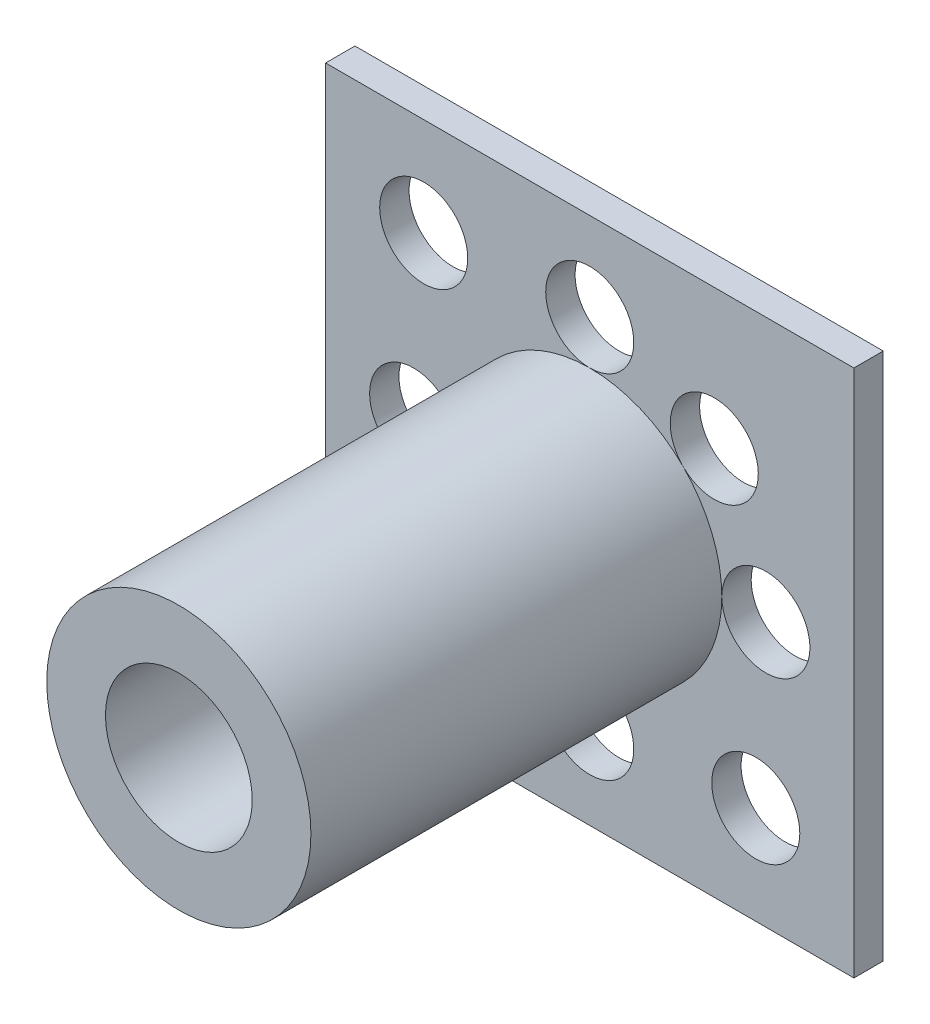
ISO-10303-21;
HEADER;
FILE_DESCRIPTION(('STEP AP214'),'2;1');
FILE_NAME('part.step','',(''),(''),'','','');
FILE_SCHEMA(('AUTOMOTIVE_DESIGN { 1 0 10303 214 1 1 1 1 }'));
ENDSEC;
DATA;
#1=APPLICATION_CONTEXT('core data for automotive mechanical design processes');
#2=APPLICATION_PROTOCOL_DEFINITION('international standard','automotive_design',2000,#1);
#3=PRODUCT_CONTEXT('',#1,'mechanical');
#4=PRODUCT('Part','Part','',(#3));
#5=PRODUCT_RELATED_PRODUCT_CATEGORY('part','',(#4));
#6=PRODUCT_DEFINITION_FORMATION('','',#4);
#7=PRODUCT_DEFINITION_CONTEXT('part definition',#1,'design');
#8=PRODUCT_DEFINITION('design','',#6,#7);
#9=PRODUCT_DEFINITION_SHAPE('','',#8);
#10=(LENGTH_UNIT() NAMED_UNIT(*) SI_UNIT(.MILLI.,.METRE.));
#11=(NAMED_UNIT(*) PLANE_ANGLE_UNIT() SI_UNIT($,.RADIAN.));
#12=(NAMED_UNIT(*) SI_UNIT($,.STERADIAN.) SOLID_ANGLE_UNIT());
#13=UNCERTAINTY_MEASURE_WITH_UNIT(LENGTH_MEASURE(1.E-05),#10,'distance_accuracy_value','');
#14=(GEOMETRIC_REPRESENTATION_CONTEXT(3) GLOBAL_UNCERTAINTY_ASSIGNED_CONTEXT((#13)) GLOBAL_UNIT_ASSIGNED_CONTEXT((#10,
#11,#12)) REPRESENTATION_CONTEXT('',''));
#15=CARTESIAN_POINT('',(0.,0.,0.));
#16=DIRECTION('',(0.,0.,1.));
#17=DIRECTION('',(1.,0.,0.));
#18=AXIS2_PLACEMENT_3D('',#15,#16,#17);
#19=CARTESIAN_POINT('',(0.,0.,15.));
#20=DIRECTION('',(0.,0.,1.));
#21=DIRECTION('',(1.,0.,0.));
#22=AXIS2_PLACEMENT_3D('',#19,#20,#21);
#23=PLANE('',#22);
#24=CARTESIAN_POINT('',(0.,0.,15.));
#25=DIRECTION('',(0.,0.,1.));
#26=DIRECTION('',(1.,0.,0.));
#27=AXIS2_PLACEMENT_3D('',#24,#25,#26);
#28=CIRCLE('',#27,4.5);
#29=CARTESIAN_POINT('',(4.5,0.,15.));
#30=VERTEX_POINT('',#29);
#31=EDGE_CURVE('E11',#30,#30,#28,.T.);
#32=ORIENTED_EDGE('',*,*,#31,.T.);
#33=EDGE_LOOP('',(#32));
#34=FACE_BOUND('',#33,.T.);
#35=CARTESIAN_POINT('',(0.,0.,15.));
#36=DIRECTION('',(0.,0.,1.));
#37=DIRECTION('',(1.,0.,0.));
#38=AXIS2_PLACEMENT_3D('',#35,#36,#37);
#39=CIRCLE('',#38,2.5);
#40=CARTESIAN_POINT('',(2.5,0.,15.));
#41=VERTEX_POINT('',#40);
#42=EDGE_CURVE('E48',#41,#41,#39,.T.);
#43=ORIENTED_EDGE('',*,*,#42,.F.);
#44=EDGE_LOOP('',(#43));
#45=FACE_BOUND('',#44,.T.);
#46=ADVANCED_FACE('F39',(#34,#45),#23,.T.);
#47=CARTESIAN_POINT('',(0.,0.,15.));
#48=DIRECTION('',(0.,0.,-1.));
#49=DIRECTION('',(-1.,0.,0.));
#50=AXIS2_PLACEMENT_3D('',#47,#48,#49);
#51=CYLINDRICAL_SURFACE('',#50,4.5);
#52=CARTESIAN_POINT('',(0.,0.,1.));
#53=DIRECTION('',(0.,0.,1.));
#54=DIRECTION('',(1.,0.,0.));
#55=AXIS2_PLACEMENT_3D('',#52,#53,#54);
#56=CIRCLE('',#55,4.5);
#57=CARTESIAN_POINT('',(4.5,0.,1.));
#58=VERTEX_POINT('',#57);
#59=CARTESIAN_POINT('',(3.18198051533946,3.18198051533946,1.));
#60=VERTEX_POINT('',#59);
#61=EDGE_CURVE('E132',#58,#60,#56,.T.);
#62=ORIENTED_EDGE('',*,*,#61,.T.);
#63=CARTESIAN_POINT('',(0.,4.5,1.));
#64=VERTEX_POINT('',#63);
#65=EDGE_CURVE('E138',#60,#64,#56,.T.);
#66=ORIENTED_EDGE('',*,*,#65,.T.);
#67=CARTESIAN_POINT('',(-4.5,0.,1.));
#68=VERTEX_POINT('',#67);
#69=EDGE_CURVE('E419',#64,#68,#56,.T.);
#70=ORIENTED_EDGE('',*,*,#69,.T.);
#71=CARTESIAN_POINT('',(-3.18198051533946,-3.18198051533946,1.));
#72=VERTEX_POINT('',#71);
#73=EDGE_CURVE('E423',#68,#72,#56,.T.);
#74=ORIENTED_EDGE('',*,*,#73,.T.);
#75=CARTESIAN_POINT('',(0.,-4.5,1.));
#76=VERTEX_POINT('',#75);
#77=EDGE_CURVE('E130',#72,#76,#56,.T.);
#78=ORIENTED_EDGE('',*,*,#77,.T.);
#79=EDGE_CURVE('E125',#76,#58,#56,.T.);
#80=ORIENTED_EDGE('',*,*,#79,.T.);
#81=EDGE_LOOP('',(#62,#66,#70,#74,#78,#80));
#82=FACE_BOUND('',#81,.T.);
#83=ORIENTED_EDGE('',*,*,#31,.F.);
#84=EDGE_LOOP('',(#83));
#85=FACE_BOUND('',#84,.T.);
#86=ADVANCED_FACE('F41',(#82,#85),#51,.T.);
#87=CARTESIAN_POINT('',(0.,0.,15.));
#88=DIRECTION('',(0.,0.,-1.));
#89=DIRECTION('',(-1.,0.,0.));
#90=AXIS2_PLACEMENT_3D('',#87,#88,#89);
#91=CYLINDRICAL_SURFACE('',#90,2.5);
#92=CARTESIAN_POINT('',(0.,0.,0.));
#93=DIRECTION('',(0.,0.,-1.));
#94=DIRECTION('',(-1.,0.,0.));
#95=AXIS2_PLACEMENT_3D('',#92,#93,#94);
#96=CIRCLE('',#95,2.5);
#97=CARTESIAN_POINT('',(-2.5,0.,0.));
#98=VERTEX_POINT('',#97);
#99=EDGE_CURVE('E199',#98,#98,#96,.T.);
#100=ORIENTED_EDGE('',*,*,#99,.T.);
#101=EDGE_LOOP('',(#100));
#102=FACE_BOUND('',#101,.T.);
#103=ORIENTED_EDGE('',*,*,#42,.T.);
#104=EDGE_LOOP('',(#103));
#105=FACE_BOUND('',#104,.T.);
#106=ADVANCED_FACE('F143',(#102,#105),#91,.F.);
#107=CARTESIAN_POINT('',(-9.,-9.,1.));
#108=DIRECTION('',(1.,0.,0.));
#109=DIRECTION('',(0.,0.,-1.));
#110=AXIS2_PLACEMENT_3D('',#107,#108,#109);
#111=PLANE('',#110);
#112=DIRECTION('',(0.,-1.,0.));
#113=VECTOR('',#112,1.);
#114=CARTESIAN_POINT('',(-9.,-9.,0.));
#115=LINE('',#114,#113);
#116=CARTESIAN_POINT('',(-9.,9.,0.));
#117=VERTEX_POINT('',#116);
#118=CARTESIAN_POINT('',(-9.,-9.,0.));
#119=VERTEX_POINT('',#118);
#120=EDGE_CURVE('E123',#117,#119,#115,.T.);
#121=ORIENTED_EDGE('',*,*,#120,.T.);
#122=DIRECTION('',(0.,0.,-1.));
#123=VECTOR('',#122,1.);
#124=CARTESIAN_POINT('',(-9.,-9.,1.));
#125=LINE('',#124,#123);
#126=CARTESIAN_POINT('',(-9.,-9.,1.));
#127=VERTEX_POINT('',#126);
#128=EDGE_CURVE('E101',#127,#119,#125,.T.);
#129=ORIENTED_EDGE('',*,*,#128,.F.);
#130=DIRECTION('',(0.,-1.,0.));
#131=VECTOR('',#130,1.);
#132=CARTESIAN_POINT('',(-9.,-9.,1.));
#133=LINE('',#132,#131);
#134=CARTESIAN_POINT('',(-9.,9.,1.));
#135=VERTEX_POINT('',#134);
#136=EDGE_CURVE('E109',#135,#127,#133,.T.);
#137=ORIENTED_EDGE('',*,*,#136,.F.);
#138=DIRECTION('',(0.,0.,-1.));
#139=VECTOR('',#138,1.);
#140=CARTESIAN_POINT('',(-9.,9.,1.));
#141=LINE('',#140,#139);
#142=EDGE_CURVE('E224',#135,#117,#141,.T.);
#143=ORIENTED_EDGE('',*,*,#142,.T.);
#144=EDGE_LOOP('',(#121,#129,#137,#143));
#145=FACE_BOUND('',#144,.T.);
#146=ADVANCED_FACE('F121',(#145),#111,.F.);
#147=CARTESIAN_POINT('',(9.,-9.,1.));
#148=DIRECTION('',(0.,1.,0.));
#149=DIRECTION('',(-1.,0.,0.));
#150=AXIS2_PLACEMENT_3D('',#147,#148,#149);
#151=PLANE('',#150);
#152=DIRECTION('',(1.,0.,0.));
#153=VECTOR('',#152,1.);
#154=CARTESIAN_POINT('',(9.,-9.,0.));
#155=LINE('',#154,#153);
#156=CARTESIAN_POINT('',(9.,-9.,0.));
#157=VERTEX_POINT('',#156);
#158=EDGE_CURVE('E206',#119,#157,#155,.T.);
#159=ORIENTED_EDGE('',*,*,#158,.T.);
#160=DIRECTION('',(0.,0.,-1.));
#161=VECTOR('',#160,1.);
#162=CARTESIAN_POINT('',(9.,-9.,1.));
#163=LINE('',#162,#161);
#164=CARTESIAN_POINT('',(9.,-9.,1.));
#165=VERTEX_POINT('',#164);
#166=EDGE_CURVE('E104',#165,#157,#163,.T.);
#167=ORIENTED_EDGE('',*,*,#166,.F.);
#168=DIRECTION('',(1.,0.,0.));
#169=VECTOR('',#168,1.);
#170=CARTESIAN_POINT('',(9.,-9.,1.));
#171=LINE('',#170,#169);
#172=EDGE_CURVE('E97',#127,#165,#171,.T.);
#173=ORIENTED_EDGE('',*,*,#172,.F.);
#174=ORIENTED_EDGE('',*,*,#128,.T.);
#175=EDGE_LOOP('',(#159,#167,#173,#174));
#176=FACE_BOUND('',#175,.T.);
#177=ADVANCED_FACE('F99',(#176),#151,.F.);
#178=CARTESIAN_POINT('',(9.,-9.,1.));
#179=DIRECTION('',(-1.,0.,0.));
#180=DIRECTION('',(0.,0.,1.));
#181=AXIS2_PLACEMENT_3D('',#178,#179,#180);
#182=PLANE('',#181);
#183=DIRECTION('',(0.,1.,0.));
#184=VECTOR('',#183,1.);
#185=CARTESIAN_POINT('',(9.,-9.,0.));
#186=LINE('',#185,#184);
#187=CARTESIAN_POINT('',(9.,9.,0.));
#188=VERTEX_POINT('',#187);
#189=EDGE_CURVE('E212',#157,#188,#186,.T.);
#190=ORIENTED_EDGE('',*,*,#189,.T.);
#191=DIRECTION('',(0.,0.,-1.));
#192=VECTOR('',#191,1.);
#193=CARTESIAN_POINT('',(9.,9.,1.));
#194=LINE('',#193,#192);
#195=CARTESIAN_POINT('',(9.,9.,1.));
#196=VERTEX_POINT('',#195);
#197=EDGE_CURVE('E133',#196,#188,#194,.T.);
#198=ORIENTED_EDGE('',*,*,#197,.F.);
#199=DIRECTION('',(0.,1.,0.));
#200=VECTOR('',#199,1.);
#201=CARTESIAN_POINT('',(9.,-9.,1.));
#202=LINE('',#201,#200);
#203=EDGE_CURVE('E108',#165,#196,#202,.T.);
#204=ORIENTED_EDGE('',*,*,#203,.F.);
#205=ORIENTED_EDGE('',*,*,#166,.T.);
#206=EDGE_LOOP('',(#190,#198,#204,#205));
#207=FACE_BOUND('',#206,.T.);
#208=ADVANCED_FACE('F231',(#207),#182,.F.);
#209=CARTESIAN_POINT('',(9.,9.,1.));
#210=DIRECTION('',(0.,-1.,0.));
#211=DIRECTION('',(1.,0.,0.));
#212=AXIS2_PLACEMENT_3D('',#209,#210,#211);
#213=PLANE('',#212);
#214=DIRECTION('',(-1.,0.,0.));
#215=VECTOR('',#214,1.);
#216=CARTESIAN_POINT('',(9.,9.,0.));
#217=LINE('',#216,#215);
#218=EDGE_CURVE('E119',#188,#117,#217,.T.);
#219=ORIENTED_EDGE('',*,*,#218,.T.);
#220=ORIENTED_EDGE('',*,*,#142,.F.);
#221=DIRECTION('',(-1.,0.,0.));
#222=VECTOR('',#221,1.);
#223=CARTESIAN_POINT('',(9.,9.,1.));
#224=LINE('',#223,#222);
#225=EDGE_CURVE('E114',#196,#135,#224,.T.);
#226=ORIENTED_EDGE('',*,*,#225,.F.);
#227=ORIENTED_EDGE('',*,*,#197,.T.);
#228=EDGE_LOOP('',(#219,#220,#226,#227));
#229=FACE_BOUND('',#228,.T.);
#230=ADVANCED_FACE('F165',(#229),#213,.F.);
#231=CARTESIAN_POINT('',(0.,0.,1.));
#232=DIRECTION('',(0.,0.,1.));
#233=DIRECTION('',(1.,0.,0.));
#234=AXIS2_PLACEMENT_3D('',#231,#232,#233);
#235=PLANE('',#234);
#236=CARTESIAN_POINT('',(5.65685424949238,-5.65685424949237,1.));
#237=DIRECTION('',(0.,0.,1.));
#238=DIRECTION('',(1.,0.,0.));
#239=AXIS2_PLACEMENT_3D('',#236,#237,#238);
#240=CIRCLE('',#239,1.5);
#241=CARTESIAN_POINT('',(7.15685424949238,-5.65685424949237,1.));
#242=VERTEX_POINT('',#241);
#243=EDGE_CURVE('E208',#242,#242,#240,.T.);
#244=ORIENTED_EDGE('',*,*,#243,.F.);
#245=EDGE_LOOP('',(#244));
#246=FACE_BOUND('',#245,.T.);
#247=CARTESIAN_POINT('',(-5.65685424949238,5.65685424949238,1.));
#248=DIRECTION('',(0.,0.,1.));
#249=DIRECTION('',(1.,0.,0.));
#250=AXIS2_PLACEMENT_3D('',#247,#248,#249);
#251=CIRCLE('',#250,1.5);
#252=CARTESIAN_POINT('',(-4.15685424949238,5.65685424949238,1.));
#253=VERTEX_POINT('',#252);
#254=EDGE_CURVE('E250',#253,#253,#251,.T.);
#255=ORIENTED_EDGE('',*,*,#254,.F.);
#256=EDGE_LOOP('',(#255));
#257=FACE_BOUND('',#256,.T.);
#258=ORIENTED_EDGE('',*,*,#65,.F.);
#259=CARTESIAN_POINT('',(4.24264068711928,4.24264068711929,1.));
#260=DIRECTION('',(0.,0.,1.));
#261=DIRECTION('',(1.,0.,0.));
#262=AXIS2_PLACEMENT_3D('',#259,#260,#261);
#263=CIRCLE('',#262,1.5);
#264=EDGE_CURVE('E215',#60,#60,#263,.T.);
#265=ORIENTED_EDGE('',*,*,#264,.F.);
#266=ORIENTED_EDGE('',*,*,#61,.F.);
#267=CARTESIAN_POINT('',(6.,0.,1.));
#268=DIRECTION('',(0.,0.,1.));
#269=DIRECTION('',(1.,0.,0.));
#270=AXIS2_PLACEMENT_3D('',#267,#268,#269);
#271=CIRCLE('',#270,1.5);
#272=EDGE_CURVE('E242',#58,#58,#271,.T.);
#273=ORIENTED_EDGE('',*,*,#272,.F.);
#274=ORIENTED_EDGE('',*,*,#79,.F.);
#275=CARTESIAN_POINT('',(0.,-6.,1.));
#276=DIRECTION('',(0.,0.,1.));
#277=DIRECTION('',(1.,0.,0.));
#278=AXIS2_PLACEMENT_3D('',#275,#276,#277);
#279=CIRCLE('',#278,1.5);
#280=EDGE_CURVE('E53',#76,#76,#279,.T.);
#281=ORIENTED_EDGE('',*,*,#280,.F.);
#282=ORIENTED_EDGE('',*,*,#77,.F.);
#283=CARTESIAN_POINT('',(-4.24264068711928,-4.24264068711928,1.));
#284=DIRECTION('',(0.,0.,1.));
#285=DIRECTION('',(1.,0.,0.));
#286=AXIS2_PLACEMENT_3D('',#283,#284,#285);
#287=CIRCLE('',#286,1.5);
#288=EDGE_CURVE('E58',#72,#72,#287,.T.);
#289=ORIENTED_EDGE('',*,*,#288,.F.);
#290=ORIENTED_EDGE('',*,*,#73,.F.);
#291=CARTESIAN_POINT('',(-6.,0.,1.));
#292=DIRECTION('',(0.,0.,1.));
#293=DIRECTION('',(1.,0.,0.));
#294=AXIS2_PLACEMENT_3D('',#291,#292,#293);
#295=CIRCLE('',#294,1.5);
#296=EDGE_CURVE('E247',#68,#68,#295,.T.);
#297=ORIENTED_EDGE('',*,*,#296,.F.);
#298=ORIENTED_EDGE('',*,*,#69,.F.);
#299=CARTESIAN_POINT('',(0.,6.,1.));
#300=DIRECTION('',(0.,0.,1.));
#301=DIRECTION('',(1.,0.,0.));
#302=AXIS2_PLACEMENT_3D('',#299,#300,#301);
#303=CIRCLE('',#302,1.5);
#304=EDGE_CURVE('E239',#64,#64,#303,.T.);
#305=ORIENTED_EDGE('',*,*,#304,.F.);
#306=EDGE_LOOP('',(#258,#265,#266,#273,#274,#281,#282,#289,#290,#297,#298,#305));
#307=FACE_BOUND('',#306,.T.);
#308=ORIENTED_EDGE('',*,*,#136,.T.);
#309=ORIENTED_EDGE('',*,*,#172,.T.);
#310=ORIENTED_EDGE('',*,*,#203,.T.);
#311=ORIENTED_EDGE('',*,*,#225,.T.);
#312=EDGE_LOOP('',(#308,#309,#310,#311));
#313=FACE_BOUND('',#312,.T.);
#314=ADVANCED_FACE('F112',(#246,#257,#307,#313),#235,.T.);
#315=CARTESIAN_POINT('',(0.,0.,0.));
#316=DIRECTION('',(0.,0.,1.));
#317=DIRECTION('',(1.,0.,0.));
#318=AXIS2_PLACEMENT_3D('',#315,#316,#317);
#319=PLANE('',#318);
#320=CARTESIAN_POINT('',(5.65685424949238,-5.65685424949237,0.));
#321=DIRECTION('',(0.,0.,-1.));
#322=DIRECTION('',(1.,0.,0.));
#323=AXIS2_PLACEMENT_3D('',#320,#321,#322);
#324=CIRCLE('',#323,1.5);
#325=CARTESIAN_POINT('',(7.15685424949238,-5.65685424949237,0.));
#326=VERTEX_POINT('',#325);
#327=EDGE_CURVE('E171',#326,#326,#324,.T.);
#328=ORIENTED_EDGE('',*,*,#327,.F.);
#329=EDGE_LOOP('',(#328));
#330=FACE_BOUND('',#329,.T.);
#331=CARTESIAN_POINT('',(4.24264068711928,4.24264068711929,0.));
#332=DIRECTION('',(0.,0.,-1.));
#333=DIRECTION('',(-1.,0.,0.));
#334=AXIS2_PLACEMENT_3D('',#331,#332,#333);
#335=CIRCLE('',#334,1.5);
#336=CARTESIAN_POINT('',(2.74264068711928,4.24264068711929,0.));
#337=VERTEX_POINT('',#336);
#338=EDGE_CURVE('E175',#337,#337,#335,.T.);
#339=ORIENTED_EDGE('',*,*,#338,.F.);
#340=EDGE_LOOP('',(#339));
#341=FACE_BOUND('',#340,.T.);
#342=CARTESIAN_POINT('',(-4.24264068711928,-4.24264068711928,0.));
#343=DIRECTION('',(0.,0.,-1.));
#344=DIRECTION('',(1.,0.,0.));
#345=AXIS2_PLACEMENT_3D('',#342,#343,#344);
#346=CIRCLE('',#345,1.5);
#347=CARTESIAN_POINT('',(-2.74264068711928,-4.24264068711928,0.));
#348=VERTEX_POINT('',#347);
#349=EDGE_CURVE('E179',#348,#348,#346,.T.);
#350=ORIENTED_EDGE('',*,*,#349,.F.);
#351=EDGE_LOOP('',(#350));
#352=FACE_BOUND('',#351,.T.);
#353=CARTESIAN_POINT('',(0.,6.,0.));
#354=DIRECTION('',(0.,0.,-1.));
#355=DIRECTION('',(-1.,0.,0.));
#356=AXIS2_PLACEMENT_3D('',#353,#354,#355);
#357=CIRCLE('',#356,1.5);
#358=CARTESIAN_POINT('',(-1.5,6.,0.));
#359=VERTEX_POINT('',#358);
#360=EDGE_CURVE('E183',#359,#359,#357,.T.);
#361=ORIENTED_EDGE('',*,*,#360,.F.);
#362=EDGE_LOOP('',(#361));
#363=FACE_BOUND('',#362,.T.);
#364=CARTESIAN_POINT('',(6.,0.,0.));
#365=DIRECTION('',(0.,0.,-1.));
#366=DIRECTION('',(-1.,0.,0.));
#367=AXIS2_PLACEMENT_3D('',#364,#365,#366);
#368=CIRCLE('',#367,1.5);
#369=CARTESIAN_POINT('',(4.5,0.,0.));
#370=VERTEX_POINT('',#369);
#371=EDGE_CURVE('E187',#370,#370,#368,.T.);
#372=ORIENTED_EDGE('',*,*,#371,.F.);
#373=EDGE_LOOP('',(#372));
#374=FACE_BOUND('',#373,.T.);
#375=CARTESIAN_POINT('',(0.,-6.,0.));
#376=DIRECTION('',(0.,0.,-1.));
#377=DIRECTION('',(-1.,0.,0.));
#378=AXIS2_PLACEMENT_3D('',#375,#376,#377);
#379=CIRCLE('',#378,1.5);
#380=CARTESIAN_POINT('',(-1.5,-6.,0.));
#381=VERTEX_POINT('',#380);
#382=EDGE_CURVE('E191',#381,#381,#379,.T.);
#383=ORIENTED_EDGE('',*,*,#382,.F.);
#384=EDGE_LOOP('',(#383));
#385=FACE_BOUND('',#384,.T.);
#386=CARTESIAN_POINT('',(-6.,0.,0.));
#387=DIRECTION('',(0.,0.,-1.));
#388=DIRECTION('',(-1.,0.,0.));
#389=AXIS2_PLACEMENT_3D('',#386,#387,#388);
#390=CIRCLE('',#389,1.5);
#391=CARTESIAN_POINT('',(-7.5,0.,0.));
#392=VERTEX_POINT('',#391);
#393=EDGE_CURVE('E195',#392,#392,#390,.T.);
#394=ORIENTED_EDGE('',*,*,#393,.F.);
#395=EDGE_LOOP('',(#394));
#396=FACE_BOUND('',#395,.T.);
#397=ORIENTED_EDGE('',*,*,#99,.F.);
#398=EDGE_LOOP('',(#397));
#399=FACE_BOUND('',#398,.T.);
#400=CARTESIAN_POINT('',(-5.65685424949238,5.65685424949238,0.));
#401=DIRECTION('',(0.,0.,-1.));
#402=DIRECTION('',(-1.,0.,0.));
#403=AXIS2_PLACEMENT_3D('',#400,#401,#402);
#404=CIRCLE('',#403,1.5);
#405=CARTESIAN_POINT('',(-7.15685424949238,5.65685424949238,0.));
#406=VERTEX_POINT('',#405);
#407=EDGE_CURVE('E203',#406,#406,#404,.T.);
#408=ORIENTED_EDGE('',*,*,#407,.F.);
#409=EDGE_LOOP('',(#408));
#410=FACE_BOUND('',#409,.T.);
#411=ORIENTED_EDGE('',*,*,#120,.F.);
#412=ORIENTED_EDGE('',*,*,#218,.F.);
#413=ORIENTED_EDGE('',*,*,#189,.F.);
#414=ORIENTED_EDGE('',*,*,#158,.F.);
#415=EDGE_LOOP('',(#411,#412,#413,#414));
#416=FACE_BOUND('',#415,.T.);
#417=ADVANCED_FACE('F154',(#330,#341,#352,#363,#374,#385,#396,#399,#410,#416),#319,.F.);
#418=CARTESIAN_POINT('',(-5.65685424949238,5.65685424949238,2.));
#419=DIRECTION('',(0.,0.,-1.));
#420=DIRECTION('',(-1.,0.,0.));
#421=AXIS2_PLACEMENT_3D('',#418,#419,#420);
#422=CYLINDRICAL_SURFACE('',#421,1.5);
#423=ORIENTED_EDGE('',*,*,#254,.T.);
#424=EDGE_LOOP('',(#423));
#425=FACE_BOUND('',#424,.T.);
#426=ORIENTED_EDGE('',*,*,#407,.T.);
#427=EDGE_LOOP('',(#426));
#428=FACE_BOUND('',#427,.T.);
#429=ADVANCED_FACE('F156',(#425,#428),#422,.F.);
#430=CARTESIAN_POINT('',(-6.,0.,2.));
#431=DIRECTION('',(0.,0.,-1.));
#432=DIRECTION('',(-1.,0.,0.));
#433=AXIS2_PLACEMENT_3D('',#430,#431,#432);
#434=CYLINDRICAL_SURFACE('',#433,1.5);
#435=ORIENTED_EDGE('',*,*,#296,.T.);
#436=EDGE_LOOP('',(#435));
#437=FACE_BOUND('',#436,.T.);
#438=ORIENTED_EDGE('',*,*,#393,.T.);
#439=EDGE_LOOP('',(#438));
#440=FACE_BOUND('',#439,.T.);
#441=ADVANCED_FACE('F162',(#437,#440),#434,.F.);
#442=CARTESIAN_POINT('',(0.,-6.,2.));
#443=DIRECTION('',(0.,0.,-1.));
#444=DIRECTION('',(-1.,0.,0.));
#445=AXIS2_PLACEMENT_3D('',#442,#443,#444);
#446=CYLINDRICAL_SURFACE('',#445,1.5);
#447=ORIENTED_EDGE('',*,*,#280,.T.);
#448=EDGE_LOOP('',(#447));
#449=FACE_BOUND('',#448,.T.);
#450=ORIENTED_EDGE('',*,*,#382,.T.);
#451=EDGE_LOOP('',(#450));
#452=FACE_BOUND('',#451,.T.);
#453=ADVANCED_FACE('F272',(#449,#452),#446,.F.);
#454=CARTESIAN_POINT('',(6.,0.,2.));
#455=DIRECTION('',(0.,0.,-1.));
#456=DIRECTION('',(-1.,0.,0.));
#457=AXIS2_PLACEMENT_3D('',#454,#455,#456);
#458=CYLINDRICAL_SURFACE('',#457,1.5);
#459=ORIENTED_EDGE('',*,*,#272,.T.);
#460=EDGE_LOOP('',(#459));
#461=FACE_BOUND('',#460,.T.);
#462=ORIENTED_EDGE('',*,*,#371,.T.);
#463=EDGE_LOOP('',(#462));
#464=FACE_BOUND('',#463,.T.);
#465=ADVANCED_FACE('F274',(#461,#464),#458,.F.);
#466=CARTESIAN_POINT('',(0.,6.,2.));
#467=DIRECTION('',(0.,0.,-1.));
#468=DIRECTION('',(-1.,0.,0.));
#469=AXIS2_PLACEMENT_3D('',#466,#467,#468);
#470=CYLINDRICAL_SURFACE('',#469,1.5);
#471=ORIENTED_EDGE('',*,*,#304,.T.);
#472=EDGE_LOOP('',(#471));
#473=FACE_BOUND('',#472,.T.);
#474=ORIENTED_EDGE('',*,*,#360,.T.);
#475=EDGE_LOOP('',(#474));
#476=FACE_BOUND('',#475,.T.);
#477=ADVANCED_FACE('F280',(#473,#476),#470,.F.);
#478=CARTESIAN_POINT('',(-4.24264068711928,-4.24264068711928,2.));
#479=DIRECTION('',(0.,0.,-1.));
#480=DIRECTION('',(-1.,0.,0.));
#481=AXIS2_PLACEMENT_3D('',#478,#479,#480);
#482=CYLINDRICAL_SURFACE('',#481,1.5);
#483=ORIENTED_EDGE('',*,*,#288,.T.);
#484=EDGE_LOOP('',(#483));
#485=FACE_BOUND('',#484,.T.);
#486=ORIENTED_EDGE('',*,*,#349,.T.);
#487=EDGE_LOOP('',(#486));
#488=FACE_BOUND('',#487,.T.);
#489=ADVANCED_FACE('F293',(#485,#488),#482,.F.);
#490=CARTESIAN_POINT('',(4.24264068711928,4.24264068711929,2.));
#491=DIRECTION('',(0.,0.,-1.));
#492=DIRECTION('',(-1.,0.,0.));
#493=AXIS2_PLACEMENT_3D('',#490,#491,#492);
#494=CYLINDRICAL_SURFACE('',#493,1.5);
#495=ORIENTED_EDGE('',*,*,#264,.T.);
#496=EDGE_LOOP('',(#495));
#497=FACE_BOUND('',#496,.T.);
#498=ORIENTED_EDGE('',*,*,#338,.T.);
#499=EDGE_LOOP('',(#498));
#500=FACE_BOUND('',#499,.T.);
#501=ADVANCED_FACE('F289',(#497,#500),#494,.F.);
#502=CARTESIAN_POINT('',(5.65685424949238,-5.65685424949237,2.));
#503=DIRECTION('',(0.,0.,-1.));
#504=DIRECTION('',(-1.,0.,0.));
#505=AXIS2_PLACEMENT_3D('',#502,#503,#504);
#506=CYLINDRICAL_SURFACE('',#505,1.5);
#507=ORIENTED_EDGE('',*,*,#243,.T.);
#508=EDGE_LOOP('',(#507));
#509=FACE_BOUND('',#508,.T.);
#510=ORIENTED_EDGE('',*,*,#327,.T.);
#511=EDGE_LOOP('',(#510));
#512=FACE_BOUND('',#511,.T.);
#513=ADVANCED_FACE('F286',(#509,#512),#506,.F.);
#514=CLOSED_SHELL('',(#46,#86,#106,#146,#177,#208,#230,#314,#417,#429,#441,#453,#465,#477,#489,
#501,#513));
#515=MANIFOLD_SOLID_BREP('B2',#514);
#516=ADVANCED_BREP_SHAPE_REPRESENTATION('',(#18,#515),#14);
#517=SHAPE_DEFINITION_REPRESENTATION(#9,#516);
ENDSEC;
END-ISO-10303-21;
